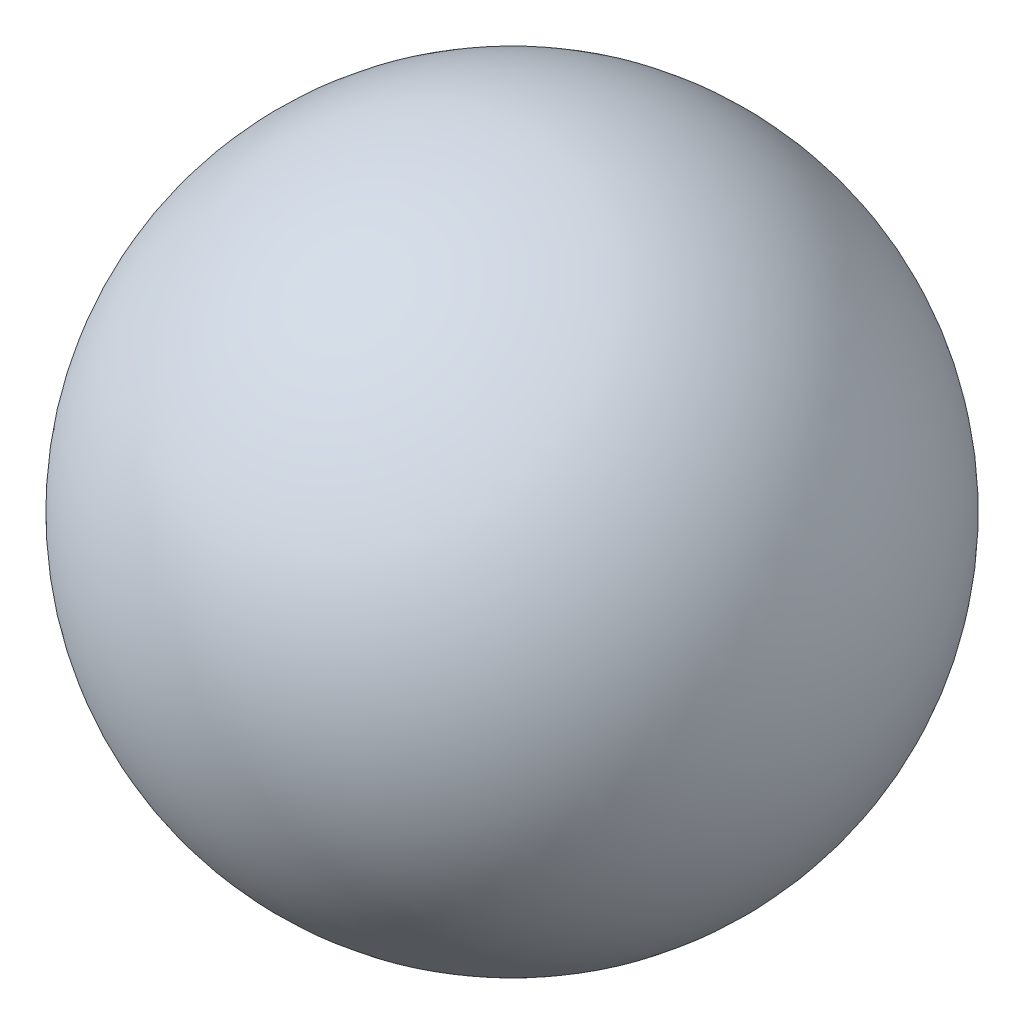
ISO-10303-21;
HEADER;
FILE_DESCRIPTION(('STEP AP214'),'2;1');
FILE_NAME('part.step','',(''),(''),'','','');
FILE_SCHEMA(('AUTOMOTIVE_DESIGN { 1 0 10303 214 1 1 1 1 }'));
ENDSEC;
DATA;
#1=APPLICATION_CONTEXT('core data for automotive mechanical design processes');
#2=APPLICATION_PROTOCOL_DEFINITION('international standard','automotive_design',2000,#1);
#3=PRODUCT_CONTEXT('',#1,'mechanical');
#4=PRODUCT('Part','Part','',(#3));
#5=PRODUCT_RELATED_PRODUCT_CATEGORY('part','',(#4));
#6=PRODUCT_DEFINITION_FORMATION('','',#4);
#7=PRODUCT_DEFINITION_CONTEXT('part definition',#1,'design');
#8=PRODUCT_DEFINITION('design','',#6,#7);
#9=PRODUCT_DEFINITION_SHAPE('','',#8);
#10=(LENGTH_UNIT() NAMED_UNIT(*) SI_UNIT(.MILLI.,.METRE.));
#11=(NAMED_UNIT(*) PLANE_ANGLE_UNIT() SI_UNIT($,.RADIAN.));
#12=(NAMED_UNIT(*) SI_UNIT($,.STERADIAN.) SOLID_ANGLE_UNIT());
#13=UNCERTAINTY_MEASURE_WITH_UNIT(LENGTH_MEASURE(1.E-05),#10,'distance_accuracy_value','');
#14=(GEOMETRIC_REPRESENTATION_CONTEXT(3) GLOBAL_UNCERTAINTY_ASSIGNED_CONTEXT((#13)) GLOBAL_UNIT_ASSIGNED_CONTEXT((#10,
#11,#12)) REPRESENTATION_CONTEXT('',''));
#15=CARTESIAN_POINT('',(0.,0.,0.));
#16=DIRECTION('',(0.,0.,1.));
#17=DIRECTION('',(1.,0.,0.));
#18=AXIS2_PLACEMENT_3D('',#15,#16,#17);
#19=CARTESIAN_POINT('',(0.,0.,0.));
#20=DIRECTION('',(0.,1.,0.));
#21=DIRECTION('',(1.,0.,0.));
#22=AXIS2_PLACEMENT_3D('',#19,#20,#21);
#23=SPHERICAL_SURFACE('',#22,40.);
#24=CARTESIAN_POINT('',(0.,40.,0.));
#25=VERTEX_POINT('',#24);
#26=VERTEX_LOOP('',#25);
#27=FACE_BOUND('',#26,.T.);
#28=ADVANCED_FACE('F31',(#27),#23,.T.);
#29=CLOSED_SHELL('',(#28));
#30=MANIFOLD_SOLID_BREP('B2',#29);
#31=ADVANCED_BREP_SHAPE_REPRESENTATION('',(#18,#30),#14);
#32=SHAPE_DEFINITION_REPRESENTATION(#9,#31);
ENDSEC;
END-ISO-10303-21;
